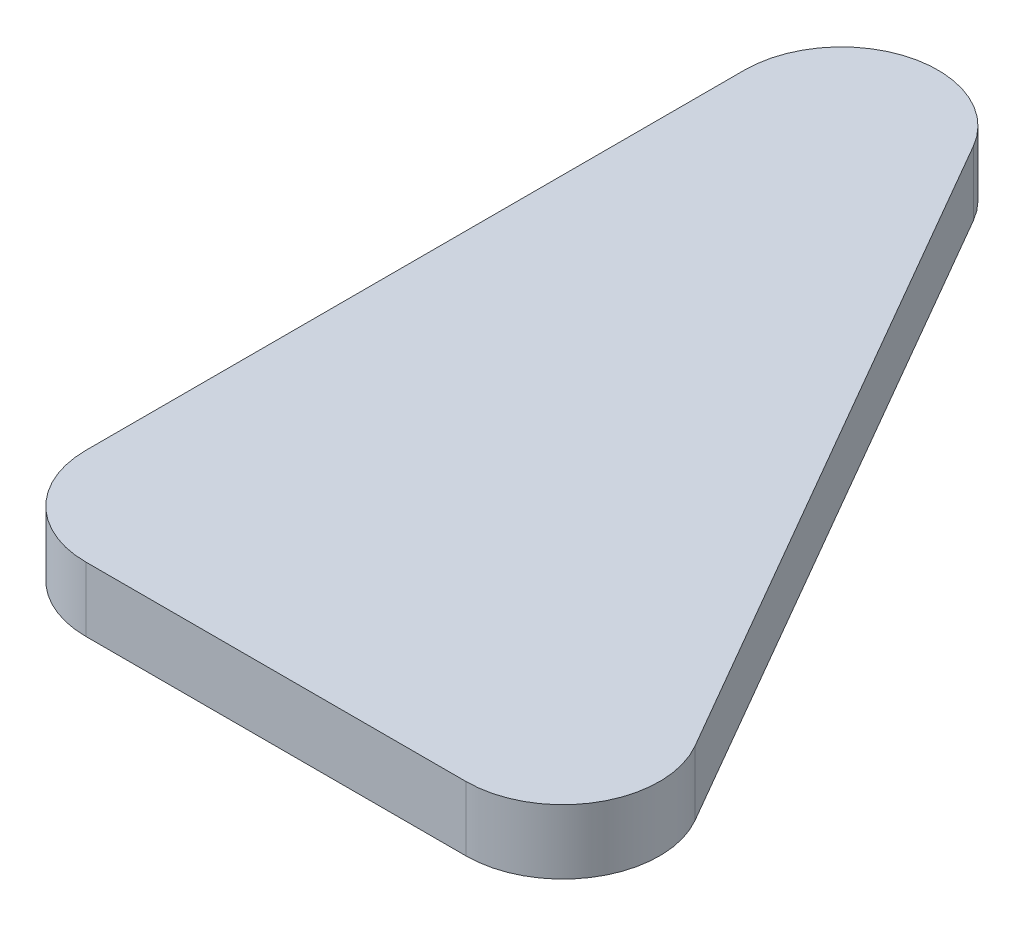
ISO-10303-21;
HEADER;
FILE_DESCRIPTION(('STEP AP214'),'2;1');
FILE_NAME('part.step','',(''),(''),'','','');
FILE_SCHEMA(('AUTOMOTIVE_DESIGN { 1 0 10303 214 1 1 1 1 }'));
ENDSEC;
DATA;
#1=APPLICATION_CONTEXT('core data for automotive mechanical design processes');
#2=APPLICATION_PROTOCOL_DEFINITION('international standard','automotive_design',2000,#1);
#3=PRODUCT_CONTEXT('',#1,'mechanical');
#4=PRODUCT('Part','Part','',(#3));
#5=PRODUCT_RELATED_PRODUCT_CATEGORY('part','',(#4));
#6=PRODUCT_DEFINITION_FORMATION('','',#4);
#7=PRODUCT_DEFINITION_CONTEXT('part definition',#1,'design');
#8=PRODUCT_DEFINITION('design','',#6,#7);
#9=PRODUCT_DEFINITION_SHAPE('','',#8);
#10=(LENGTH_UNIT() NAMED_UNIT(*) SI_UNIT(.MILLI.,.METRE.));
#11=(NAMED_UNIT(*) PLANE_ANGLE_UNIT() SI_UNIT($,.RADIAN.));
#12=(NAMED_UNIT(*) SI_UNIT($,.STERADIAN.) SOLID_ANGLE_UNIT());
#13=UNCERTAINTY_MEASURE_WITH_UNIT(LENGTH_MEASURE(1.E-05),#10,'distance_accuracy_value','');
#14=(GEOMETRIC_REPRESENTATION_CONTEXT(3) GLOBAL_UNCERTAINTY_ASSIGNED_CONTEXT((#13)) GLOBAL_UNIT_ASSIGNED_CONTEXT((#10,
#11,#12)) REPRESENTATION_CONTEXT('',''));
#15=CARTESIAN_POINT('',(0.,0.,0.));
#16=DIRECTION('',(0.,0.,1.));
#17=DIRECTION('',(1.,0.,0.));
#18=AXIS2_PLACEMENT_3D('',#15,#16,#17);
#19=CARTESIAN_POINT('',(10.,2.,17.32));
#20=DIRECTION('',(-0.866019052628739,0.,0.500011000363013));
#21=DIRECTION('',(0.500011000363013,0.,0.866019052628739));
#22=AXIS2_PLACEMENT_3D('',#19,#20,#21);
#23=PLANE('',#22);
#24=DIRECTION('',(-0.500011000363013,0.,-0.866019052628739));
#25=VECTOR('',#24,1.);
#26=CARTESIAN_POINT('',(10.,0.,17.32));
#27=LINE('',#26,#25);
#28=CARTESIAN_POINT('',(7.40182852131118,0.,12.819966998911));
#29=VERTEX_POINT('',#28);
#30=CARTESIAN_POINT('',(-4.40194284211379,0.,-7.62416500254108));
#31=VERTEX_POINT('',#30);
#32=EDGE_CURVE('E113',#29,#31,#27,.T.);
#33=ORIENTED_EDGE('',*,*,#32,.T.);
#34=DIRECTION('',(0.,-1.,0.));
#35=VECTOR('',#34,1.);
#36=CARTESIAN_POINT('',(-4.40194284211379,2.,-7.62416500254107));
#37=LINE('',#36,#35);
#38=CARTESIAN_POINT('',(-4.40194284211379,2.,-7.62416500254108));
#39=VERTEX_POINT('',#38);
#40=EDGE_CURVE('E92',#31,#39,#37,.F.);
#41=ORIENTED_EDGE('',*,*,#40,.T.);
#42=DIRECTION('',(-0.500011000363013,0.,-0.866019052628739));
#43=VECTOR('',#42,1.);
#44=CARTESIAN_POINT('',(10.,2.,17.32));
#45=LINE('',#44,#43);
#46=CARTESIAN_POINT('',(7.40182852131118,2.,12.819966998911));
#47=VERTEX_POINT('',#46);
#48=EDGE_CURVE('E115',#47,#39,#45,.T.);
#49=ORIENTED_EDGE('',*,*,#48,.F.);
#50=DIRECTION('',(0.,-1.,0.));
#51=VECTOR('',#50,1.);
#52=CARTESIAN_POINT('',(7.40182852131118,2.,12.819966998911));
#53=LINE('',#52,#51);
#54=EDGE_CURVE('E97',#47,#29,#53,.T.);
#55=ORIENTED_EDGE('',*,*,#54,.T.);
#56=EDGE_LOOP('',(#33,#41,#49,#55));
#57=FACE_BOUND('',#56,.T.);
#58=ADVANCED_FACE('F33',(#57),#23,.F.);
#59=CARTESIAN_POINT('',(-10.,2.,-17.32));
#60=DIRECTION('',(1.,0.,0.));
#61=DIRECTION('',(0.,0.,-1.));
#62=AXIS2_PLACEMENT_3D('',#59,#60,#61);
#63=PLANE('',#62);
#64=DIRECTION('',(0.,0.,1.));
#65=VECTOR('',#64,1.);
#66=CARTESIAN_POINT('',(-10.,2.,-17.32));
#67=LINE('',#66,#65);
#68=CARTESIAN_POINT('',(-10.,2.,-6.12413200145203));
#69=VERTEX_POINT('',#68);
#70=CARTESIAN_POINT('',(-10.,2.,14.32));
#71=VERTEX_POINT('',#70);
#72=EDGE_CURVE('E106',#69,#71,#67,.T.);
#73=ORIENTED_EDGE('',*,*,#72,.F.);
#74=DIRECTION('',(0.,-1.,0.));
#75=VECTOR('',#74,1.);
#76=CARTESIAN_POINT('',(-10.,2.,-6.12413200145203));
#77=LINE('',#76,#75);
#78=CARTESIAN_POINT('',(-10.,0.,-6.12413200145203));
#79=VERTEX_POINT('',#78);
#80=EDGE_CURVE('E91',#69,#79,#77,.T.);
#81=ORIENTED_EDGE('',*,*,#80,.T.);
#82=DIRECTION('',(0.,0.,1.));
#83=VECTOR('',#82,1.);
#84=CARTESIAN_POINT('',(-10.,0.,-17.32));
#85=LINE('',#84,#83);
#86=CARTESIAN_POINT('',(-10.,0.,14.32));
#87=VERTEX_POINT('',#86);
#88=EDGE_CURVE('E104',#79,#87,#85,.T.);
#89=ORIENTED_EDGE('',*,*,#88,.T.);
#90=DIRECTION('',(0.,-1.,0.));
#91=VECTOR('',#90,1.);
#92=CARTESIAN_POINT('',(-10.,2.,14.32));
#93=LINE('',#92,#91);
#94=EDGE_CURVE('E108',#87,#71,#93,.F.);
#95=ORIENTED_EDGE('',*,*,#94,.T.);
#96=EDGE_LOOP('',(#73,#81,#89,#95));
#97=FACE_BOUND('',#96,.T.);
#98=ADVANCED_FACE('F103',(#97),#63,.F.);
#99=CARTESIAN_POINT('',(-10.,2.,17.32));
#100=DIRECTION('',(0.,0.,-1.));
#101=DIRECTION('',(-1.,0.,0.));
#102=AXIS2_PLACEMENT_3D('',#99,#100,#101);
#103=PLANE('',#102);
#104=DIRECTION('',(1.,0.,0.));
#105=VECTOR('',#104,1.);
#106=CARTESIAN_POINT('',(-10.,2.,17.32));
#107=LINE('',#106,#105);
#108=CARTESIAN_POINT('',(-7.,2.,17.32));
#109=VERTEX_POINT('',#108);
#110=CARTESIAN_POINT('',(4.80377136342496,2.,17.32));
#111=VERTEX_POINT('',#110);
#112=EDGE_CURVE('E120',#109,#111,#107,.T.);
#113=ORIENTED_EDGE('',*,*,#112,.F.);
#114=DIRECTION('',(0.,-1.,0.));
#115=VECTOR('',#114,1.);
#116=CARTESIAN_POINT('',(-7.,2.,17.32));
#117=LINE('',#116,#115);
#118=CARTESIAN_POINT('',(-7.,0.,17.32));
#119=VERTEX_POINT('',#118);
#120=EDGE_CURVE('E11',#109,#119,#117,.T.);
#121=ORIENTED_EDGE('',*,*,#120,.T.);
#122=DIRECTION('',(1.,0.,0.));
#123=VECTOR('',#122,1.);
#124=CARTESIAN_POINT('',(-10.,0.,17.32));
#125=LINE('',#124,#123);
#126=CARTESIAN_POINT('',(4.80377136342496,0.,17.32));
#127=VERTEX_POINT('',#126);
#128=EDGE_CURVE('E112',#119,#127,#125,.T.);
#129=ORIENTED_EDGE('',*,*,#128,.T.);
#130=DIRECTION('',(0.,-1.,0.));
#131=VECTOR('',#130,1.);
#132=CARTESIAN_POINT('',(4.80377136342496,2.,17.32));
#133=LINE('',#132,#131);
#134=EDGE_CURVE('E41',#127,#111,#133,.F.);
#135=ORIENTED_EDGE('',*,*,#134,.T.);
#136=EDGE_LOOP('',(#113,#121,#129,#135));
#137=FACE_BOUND('',#136,.T.);
#138=ADVANCED_FACE('F141',(#137),#103,.F.);
#139=CARTESIAN_POINT('',(0.,2.,0.));
#140=DIRECTION('',(0.,-1.,0.));
#141=DIRECTION('',(0.,0.,-1.));
#142=AXIS2_PLACEMENT_3D('',#139,#140,#141);
#143=PLANE('',#142);
#144=ORIENTED_EDGE('',*,*,#48,.T.);
#145=CARTESIAN_POINT('',(-7.,2.,-6.12413200145203));
#146=DIRECTION('',(0.,-1.,0.));
#147=DIRECTION('',(0.,0.,-1.));
#148=AXIS2_PLACEMENT_3D('',#145,#146,#147);
#149=CIRCLE('',#148,3.);
#150=EDGE_CURVE('E130',#39,#69,#149,.F.);
#151=ORIENTED_EDGE('',*,*,#150,.T.);
#152=ORIENTED_EDGE('',*,*,#72,.T.);
#153=CARTESIAN_POINT('',(-7.,2.,14.32));
#154=DIRECTION('',(0.,-1.,0.));
#155=DIRECTION('',(0.,0.,-1.));
#156=AXIS2_PLACEMENT_3D('',#153,#154,#155);
#157=CIRCLE('',#156,3.);
#158=EDGE_CURVE('E54',#71,#109,#157,.F.);
#159=ORIENTED_EDGE('',*,*,#158,.T.);
#160=ORIENTED_EDGE('',*,*,#112,.T.);
#161=CARTESIAN_POINT('',(4.80377136342496,2.,14.32));
#162=DIRECTION('',(0.,-1.,0.));
#163=DIRECTION('',(0.,0.,-1.));
#164=AXIS2_PLACEMENT_3D('',#161,#162,#163);
#165=CIRCLE('',#164,3.);
#166=EDGE_CURVE('E127',#111,#47,#165,.F.);
#167=ORIENTED_EDGE('',*,*,#166,.T.);
#168=EDGE_LOOP('',(#144,#151,#152,#159,#160,#167));
#169=FACE_BOUND('',#168,.T.);
#170=ADVANCED_FACE('F132',(#169),#143,.F.);
#171=CARTESIAN_POINT('',(0.,0.,0.));
#172=DIRECTION('',(0.,-1.,0.));
#173=DIRECTION('',(0.,0.,-1.));
#174=AXIS2_PLACEMENT_3D('',#171,#172,#173);
#175=PLANE('',#174);
#176=ORIENTED_EDGE('',*,*,#88,.F.);
#177=CARTESIAN_POINT('',(-7.,0.,-6.12413200145203));
#178=DIRECTION('',(0.,-1.,0.));
#179=DIRECTION('',(0.,0.,-1.));
#180=AXIS2_PLACEMENT_3D('',#177,#178,#179);
#181=CIRCLE('',#180,3.);
#182=EDGE_CURVE('E87',#79,#31,#181,.T.);
#183=ORIENTED_EDGE('',*,*,#182,.T.);
#184=ORIENTED_EDGE('',*,*,#32,.F.);
#185=CARTESIAN_POINT('',(4.80377136342496,0.,14.32));
#186=DIRECTION('',(0.,-1.,0.));
#187=DIRECTION('',(0.,0.,-1.));
#188=AXIS2_PLACEMENT_3D('',#185,#186,#187);
#189=CIRCLE('',#188,3.);
#190=EDGE_CURVE('E107',#29,#127,#189,.T.);
#191=ORIENTED_EDGE('',*,*,#190,.T.);
#192=ORIENTED_EDGE('',*,*,#128,.F.);
#193=CARTESIAN_POINT('',(-7.,0.,14.32));
#194=DIRECTION('',(0.,-1.,0.));
#195=DIRECTION('',(0.,0.,-1.));
#196=AXIS2_PLACEMENT_3D('',#193,#194,#195);
#197=CIRCLE('',#196,3.);
#198=EDGE_CURVE('E98',#119,#87,#197,.T.);
#199=ORIENTED_EDGE('',*,*,#198,.T.);
#200=EDGE_LOOP('',(#176,#183,#184,#191,#192,#199));
#201=FACE_BOUND('',#200,.T.);
#202=ADVANCED_FACE('F110',(#201),#175,.T.);
#203=CARTESIAN_POINT('',(-7.,2.,-6.12413200145203));
#204=DIRECTION('',(0.,-1.,0.));
#205=DIRECTION('',(0.,0.,-1.));
#206=AXIS2_PLACEMENT_3D('',#203,#204,#205);
#207=CYLINDRICAL_SURFACE('',#206,3.);
#208=ORIENTED_EDGE('',*,*,#150,.F.);
#209=ORIENTED_EDGE('',*,*,#40,.F.);
#210=ORIENTED_EDGE('',*,*,#182,.F.);
#211=ORIENTED_EDGE('',*,*,#80,.F.);
#212=EDGE_LOOP('',(#208,#209,#210,#211));
#213=FACE_BOUND('',#212,.T.);
#214=ADVANCED_FACE('F90',(#213),#207,.T.);
#215=CARTESIAN_POINT('',(-7.,2.,14.32));
#216=DIRECTION('',(0.,-1.,0.));
#217=DIRECTION('',(0.,0.,-1.));
#218=AXIS2_PLACEMENT_3D('',#215,#216,#217);
#219=CYLINDRICAL_SURFACE('',#218,3.);
#220=ORIENTED_EDGE('',*,*,#158,.F.);
#221=ORIENTED_EDGE('',*,*,#94,.F.);
#222=ORIENTED_EDGE('',*,*,#198,.F.);
#223=ORIENTED_EDGE('',*,*,#120,.F.);
#224=EDGE_LOOP('',(#220,#221,#222,#223));
#225=FACE_BOUND('',#224,.T.);
#226=ADVANCED_FACE('F143',(#225),#219,.T.);
#227=CARTESIAN_POINT('',(4.80377136342496,2.,14.32));
#228=DIRECTION('',(0.,-1.,0.));
#229=DIRECTION('',(0.,0.,-1.));
#230=AXIS2_PLACEMENT_3D('',#227,#228,#229);
#231=CYLINDRICAL_SURFACE('',#230,3.);
#232=ORIENTED_EDGE('',*,*,#166,.F.);
#233=ORIENTED_EDGE('',*,*,#134,.F.);
#234=ORIENTED_EDGE('',*,*,#190,.F.);
#235=ORIENTED_EDGE('',*,*,#54,.F.);
#236=EDGE_LOOP('',(#232,#233,#234,#235));
#237=FACE_BOUND('',#236,.T.);
#238=ADVANCED_FACE('F35',(#237),#231,.T.);
#239=CLOSED_SHELL('',(#58,#98,#138,#170,#202,#214,#226,#238));
#240=MANIFOLD_SOLID_BREP('B2',#239);
#241=ADVANCED_BREP_SHAPE_REPRESENTATION('',(#18,#240),#14);
#242=SHAPE_DEFINITION_REPRESENTATION(#9,#241);
ENDSEC;
END-ISO-10303-21;
